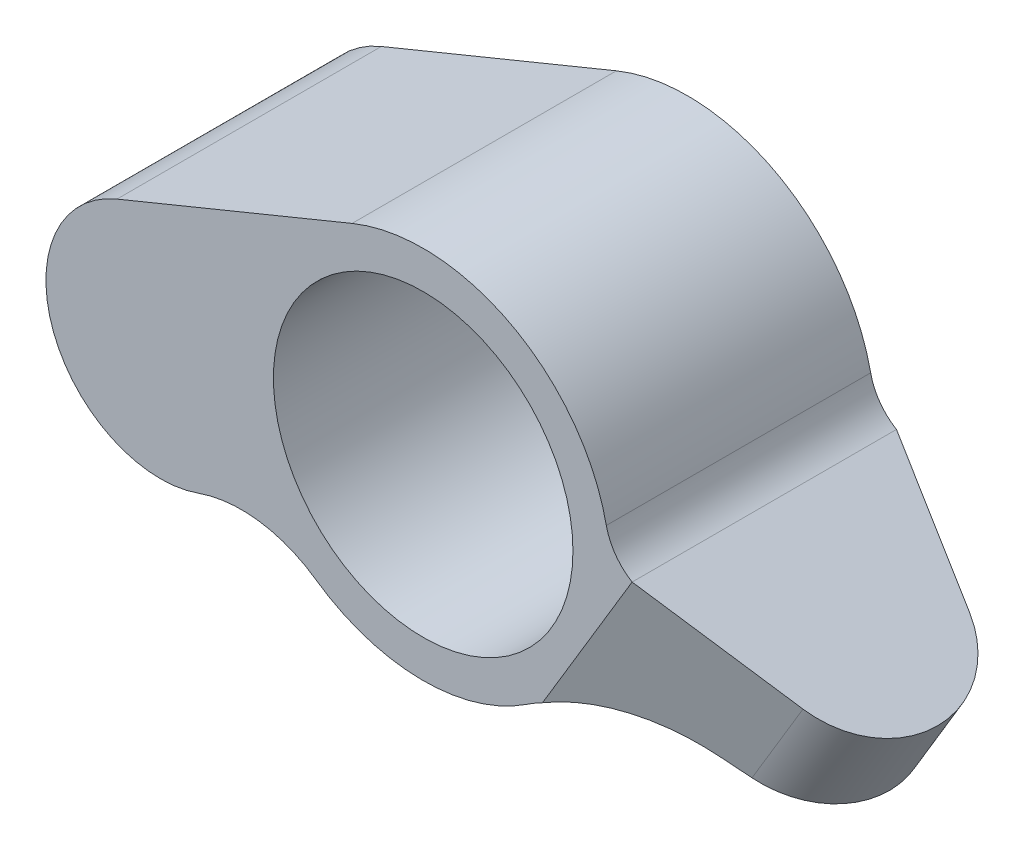
ISO-10303-21;
HEADER;
FILE_DESCRIPTION(('STEP AP214'),'2;1');
FILE_NAME('part.step','',(''),(''),'','','');
FILE_SCHEMA(('AUTOMOTIVE_DESIGN { 1 0 10303 214 1 1 1 1 }'));
ENDSEC;
DATA;
#1=APPLICATION_CONTEXT('core data for automotive mechanical design processes');
#2=APPLICATION_PROTOCOL_DEFINITION('international standard','automotive_design',2000,#1);
#3=PRODUCT_CONTEXT('',#1,'mechanical');
#4=PRODUCT('Part','Part','',(#3));
#5=PRODUCT_RELATED_PRODUCT_CATEGORY('part','',(#4));
#6=PRODUCT_DEFINITION_FORMATION('','',#4);
#7=PRODUCT_DEFINITION_CONTEXT('part definition',#1,'design');
#8=PRODUCT_DEFINITION('design','',#6,#7);
#9=PRODUCT_DEFINITION_SHAPE('','',#8);
#10=(LENGTH_UNIT() NAMED_UNIT(*) SI_UNIT(.MILLI.,.METRE.));
#11=(NAMED_UNIT(*) PLANE_ANGLE_UNIT() SI_UNIT($,.RADIAN.));
#12=(NAMED_UNIT(*) SI_UNIT($,.STERADIAN.) SOLID_ANGLE_UNIT());
#13=UNCERTAINTY_MEASURE_WITH_UNIT(LENGTH_MEASURE(1.E-05),#10,'distance_accuracy_value','');
#14=(GEOMETRIC_REPRESENTATION_CONTEXT(3) GLOBAL_UNCERTAINTY_ASSIGNED_CONTEXT((#13)) GLOBAL_UNIT_ASSIGNED_CONTEXT((#10,
#11,#12)) REPRESENTATION_CONTEXT('',''));
#15=CARTESIAN_POINT('',(0.,0.,0.));
#16=DIRECTION('',(0.,0.,1.));
#17=DIRECTION('',(1.,0.,0.));
#18=AXIS2_PLACEMENT_3D('',#15,#16,#17);
#19=CARTESIAN_POINT('',(0.,0.,30.));
#20=DIRECTION('',(0.,0.,1.));
#21=DIRECTION('',(1.,0.,0.));
#22=AXIS2_PLACEMENT_3D('',#19,#20,#21);
#23=PLANE('',#22);
#24=DIRECTION('',(0.514597737540942,0.857431728196329,0.));
#25=VECTOR('',#24,1.);
#26=CARTESIAN_POINT('',(-3.4107831080691,-44.8994779564358,30.));
#27=LINE('',#26,#25);
#28=CARTESIAN_POINT('',(13.5424140480731,-16.6517650817021,30.));
#29=VERTEX_POINT('',#28);
#30=CARTESIAN_POINT('',(23.7149593753169,0.297907417392657,30.));
#31=VERTEX_POINT('',#30);
#32=EDGE_CURVE('E178',#29,#31,#27,.T.);
#33=ORIENTED_EDGE('',*,*,#32,.T.);
#34=CARTESIAN_POINT('',(26.9616140781212,5.70754012581619,30.));
#35=DIRECTION('',(0.,0.,-1.));
#36=DIRECTION('',(1.,0.,0.));
#37=AXIS2_PLACEMENT_3D('',#34,#35,#36);
#38=CIRCLE('',#37,6.30911188673074);
#39=CARTESIAN_POINT('',(20.7892874601642,4.40091205304736,30.));
#40=VERTEX_POINT('',#39);
#41=EDGE_CURVE('E234',#31,#40,#38,.T.);
#42=ORIENTED_EDGE('',*,*,#41,.T.);
#43=CARTESIAN_POINT('',(0.,0.,30.));
#44=DIRECTION('',(0.,0.,1.));
#45=DIRECTION('',(1.,0.,0.));
#46=AXIS2_PLACEMENT_3D('',#43,#44,#45);
#47=CIRCLE('',#46,21.25);
#48=CARTESIAN_POINT('',(-8.06749821939952,19.6590430204521,30.));
#49=VERTEX_POINT('',#48);
#50=EDGE_CURVE('E112',#40,#49,#47,.T.);
#51=ORIENTED_EDGE('',*,*,#50,.T.);
#52=DIRECTION('',(-0.925131436256568,-0.379646975030566,0.));
#53=VECTOR('',#52,1.);
#54=CARTESIAN_POINT('',(-34.7513665540024,8.70876125688181,30.));
#55=LINE('',#54,#53);
#56=CARTESIAN_POINT('',(-34.7513665540024,8.70876125688181,30.));
#57=VERTEX_POINT('',#56);
#58=EDGE_CURVE('E105',#49,#57,#55,.T.);
#59=ORIENTED_EDGE('',*,*,#58,.T.);
#60=CARTESIAN_POINT('',(-29.815955878605,-3.31794741445358,30.));
#61=DIRECTION('',(0.,0.,1.));
#62=DIRECTION('',(1.,0.,0.));
#63=AXIS2_PLACEMENT_3D('',#60,#61,#62);
#64=CIRCLE('',#63,13.);
#65=CARTESIAN_POINT('',(-25.5062697870249,-15.5827998714561,30.));
#66=VERTEX_POINT('',#65);
#67=EDGE_CURVE('E110',#57,#66,#64,.T.);
#68=ORIENTED_EDGE('',*,*,#67,.T.);
#69=CARTESIAN_POINT('',(-20.6251605038312,-29.4738545591366,30.));
#70=DIRECTION('',(0.,0.,-1.));
#71=DIRECTION('',(1.,0.,0.));
#72=AXIS2_PLACEMENT_3D('',#69,#70,#71);
#73=CIRCLE('',#72,14.7236757696782);
#74=CARTESIAN_POINT('',(-12.1834828198412,-17.4104924220607,30.));
#75=VERTEX_POINT('',#74);
#76=EDGE_CURVE('E54',#66,#75,#73,.T.);
#77=ORIENTED_EDGE('',*,*,#76,.T.);
#78=CARTESIAN_POINT('',(0.,0.,30.));
#79=DIRECTION('',(0.,0.,1.));
#80=DIRECTION('',(1.,0.,0.));
#81=AXIS2_PLACEMENT_3D('',#78,#79,#80);
#82=CIRCLE('',#81,21.25);
#83=CARTESIAN_POINT('',(11.7883045630856,-17.680451790832,30.));
#84=VERTEX_POINT('',#83);
#85=EDGE_CURVE('E144',#75,#84,#82,.T.);
#86=ORIENTED_EDGE('',*,*,#85,.T.);
#87=CARTESIAN_POINT('',(21.5753117139314,-32.3592978607678,30.));
#88=DIRECTION('',(0.,0.,-1.));
#89=DIRECTION('',(1.,0.,0.));
#90=AXIS2_PLACEMENT_3D('',#87,#88,#89);
#91=CIRCLE('',#90,17.6423930042264);
#92=EDGE_CURVE('E95',#84,#29,#91,.T.);
#93=ORIENTED_EDGE('',*,*,#92,.T.);
#94=EDGE_LOOP('',(#33,#42,#51,#59,#68,#77,#86,#93));
#95=FACE_BOUND('',#94,.T.);
#96=CARTESIAN_POINT('',(0.,0.,30.));
#97=DIRECTION('',(0.,0.,1.));
#98=DIRECTION('',(1.,0.,0.));
#99=AXIS2_PLACEMENT_3D('',#96,#97,#98);
#100=CIRCLE('',#99,17.);
#101=CARTESIAN_POINT('',(17.,0.,30.));
#102=VERTEX_POINT('',#101);
#103=EDGE_CURVE('E134',#102,#102,#100,.T.);
#104=ORIENTED_EDGE('',*,*,#103,.F.);
#105=EDGE_LOOP('',(#104));
#106=FACE_BOUND('',#105,.T.);
#107=ADVANCED_FACE('F37',(#95,#106),#23,.T.);
#108=CARTESIAN_POINT('',(0.,0.,0.));
#109=DIRECTION('',(0.,0.,1.));
#110=DIRECTION('',(1.,0.,0.));
#111=AXIS2_PLACEMENT_3D('',#108,#109,#110);
#112=PLANE('',#111);
#113=CARTESIAN_POINT('',(26.9616140781212,5.70754012581619,0.));
#114=DIRECTION('',(0.,0.,-1.));
#115=DIRECTION('',(1.,0.,0.));
#116=AXIS2_PLACEMENT_3D('',#113,#114,#115);
#117=CIRCLE('',#116,6.30911188673074);
#118=CARTESIAN_POINT('',(23.7149593753169,0.297907417392654,0.));
#119=VERTEX_POINT('',#118);
#120=CARTESIAN_POINT('',(20.7892874601642,4.40091205304736,0.));
#121=VERTEX_POINT('',#120);
#122=EDGE_CURVE('E137',#119,#121,#117,.T.);
#123=ORIENTED_EDGE('',*,*,#122,.F.);
#124=DIRECTION('',(0.514597737540942,0.857431728196329,0.));
#125=VECTOR('',#124,1.);
#126=CARTESIAN_POINT('',(-3.4107831080691,-44.8994779564358,0.));
#127=LINE('',#126,#125);
#128=CARTESIAN_POINT('',(13.5424140480732,-16.6517650817021,0.));
#129=VERTEX_POINT('',#128);
#130=EDGE_CURVE('E204',#129,#119,#127,.T.);
#131=ORIENTED_EDGE('',*,*,#130,.F.);
#132=CARTESIAN_POINT('',(21.5753117139314,-32.3592978607678,0.));
#133=DIRECTION('',(0.,0.,-1.));
#134=DIRECTION('',(1.,0.,0.));
#135=AXIS2_PLACEMENT_3D('',#132,#133,#134);
#136=CIRCLE('',#135,17.6423930042264);
#137=CARTESIAN_POINT('',(11.7883045630856,-17.680451790832,0.));
#138=VERTEX_POINT('',#137);
#139=EDGE_CURVE('E133',#138,#129,#136,.T.);
#140=ORIENTED_EDGE('',*,*,#139,.F.);
#141=CARTESIAN_POINT('',(0.,0.,0.));
#142=DIRECTION('',(0.,0.,1.));
#143=DIRECTION('',(1.,0.,0.));
#144=AXIS2_PLACEMENT_3D('',#141,#142,#143);
#145=CIRCLE('',#144,21.25);
#146=CARTESIAN_POINT('',(-12.1834828198412,-17.4104924220607,0.));
#147=VERTEX_POINT('',#146);
#148=EDGE_CURVE('E130',#147,#138,#145,.T.);
#149=ORIENTED_EDGE('',*,*,#148,.F.);
#150=CARTESIAN_POINT('',(-20.6251605038312,-29.4738545591366,0.));
#151=DIRECTION('',(0.,0.,-1.));
#152=DIRECTION('',(1.,0.,0.));
#153=AXIS2_PLACEMENT_3D('',#150,#151,#152);
#154=CIRCLE('',#153,14.7236757696782);
#155=CARTESIAN_POINT('',(-25.5062697870249,-15.5827998714561,0.));
#156=VERTEX_POINT('',#155);
#157=EDGE_CURVE('E87',#156,#147,#154,.T.);
#158=ORIENTED_EDGE('',*,*,#157,.F.);
#159=CARTESIAN_POINT('',(-29.815955878605,-3.31794741445358,0.));
#160=DIRECTION('',(0.,0.,1.));
#161=DIRECTION('',(1.,0.,0.));
#162=AXIS2_PLACEMENT_3D('',#159,#160,#161);
#163=CIRCLE('',#162,13.);
#164=CARTESIAN_POINT('',(-34.7513665540024,8.70876125688181,0.));
#165=VERTEX_POINT('',#164);
#166=EDGE_CURVE('E81',#165,#156,#163,.T.);
#167=ORIENTED_EDGE('',*,*,#166,.F.);
#168=DIRECTION('',(-0.925131436256568,-0.379646975030566,0.));
#169=VECTOR('',#168,1.);
#170=CARTESIAN_POINT('',(-34.7513665540024,8.70876125688181,0.));
#171=LINE('',#170,#169);
#172=CARTESIAN_POINT('',(-8.06749821939952,19.6590430204521,0.));
#173=VERTEX_POINT('',#172);
#174=EDGE_CURVE('E120',#173,#165,#171,.T.);
#175=ORIENTED_EDGE('',*,*,#174,.F.);
#176=CARTESIAN_POINT('',(0.,0.,0.));
#177=DIRECTION('',(0.,0.,1.));
#178=DIRECTION('',(1.,0.,0.));
#179=AXIS2_PLACEMENT_3D('',#176,#177,#178);
#180=CIRCLE('',#179,21.25);
#181=EDGE_CURVE('E139',#121,#173,#180,.T.);
#182=ORIENTED_EDGE('',*,*,#181,.F.);
#183=EDGE_LOOP('',(#123,#131,#140,#149,#158,#167,#175,#182));
#184=FACE_BOUND('',#183,.T.);
#185=CARTESIAN_POINT('',(0.,0.,0.));
#186=DIRECTION('',(0.,0.,1.));
#187=DIRECTION('',(1.,0.,0.));
#188=AXIS2_PLACEMENT_3D('',#185,#186,#187);
#189=CIRCLE('',#188,17.);
#190=CARTESIAN_POINT('',(17.,0.,0.));
#191=VERTEX_POINT('',#190);
#192=EDGE_CURVE('E227',#191,#191,#189,.T.);
#193=ORIENTED_EDGE('',*,*,#192,.T.);
#194=EDGE_LOOP('',(#193));
#195=FACE_BOUND('',#194,.T.);
#196=ADVANCED_FACE('F244',(#184,#195),#112,.F.);
#197=CARTESIAN_POINT('',(0.,0.,30.));
#198=DIRECTION('',(0.,0.,-1.));
#199=DIRECTION('',(-1.,0.,0.));
#200=AXIS2_PLACEMENT_3D('',#197,#198,#199);
#201=CYLINDRICAL_SURFACE('',#200,21.25);
#202=ORIENTED_EDGE('',*,*,#148,.T.);
#203=DIRECTION('',(0.,0.,-1.));
#204=VECTOR('',#203,1.);
#205=CARTESIAN_POINT('',(11.7883045630856,-17.680451790832,30.));
#206=LINE('',#205,#204);
#207=EDGE_CURVE('E11',#84,#138,#206,.T.);
#208=ORIENTED_EDGE('',*,*,#207,.F.);
#209=ORIENTED_EDGE('',*,*,#85,.F.);
#210=DIRECTION('',(0.,0.,-1.));
#211=VECTOR('',#210,1.);
#212=CARTESIAN_POINT('',(-12.1834828198412,-17.4104924220607,30.));
#213=LINE('',#212,#211);
#214=EDGE_CURVE('E126',#75,#147,#213,.T.);
#215=ORIENTED_EDGE('',*,*,#214,.T.);
#216=EDGE_LOOP('',(#202,#208,#209,#215));
#217=FACE_BOUND('',#216,.T.);
#218=ADVANCED_FACE('F39',(#217),#201,.T.);
#219=CARTESIAN_POINT('',(21.5753117139314,-32.3592978607678,30.));
#220=DIRECTION('',(0.,0.,-1.));
#221=DIRECTION('',(-1.,0.,0.));
#222=AXIS2_PLACEMENT_3D('',#219,#220,#221);
#223=CYLINDRICAL_SURFACE('',#222,17.6423930042264);
#224=DIRECTION('',(0.,0.,-1.));
#225=VECTOR('',#224,1.);
#226=CARTESIAN_POINT('',(29.1269563430686,-16.4148099633532,30.));
#227=LINE('',#226,#225);
#228=CARTESIAN_POINT('',(29.1269563430686,-16.4148099633532,25.4705194765817));
#229=VERTEX_POINT('',#228);
#230=CARTESIAN_POINT('',(29.1269563430686,-16.4148099633532,4.53956595923639));
#231=VERTEX_POINT('',#230);
#232=EDGE_CURVE('E46',#229,#231,#227,.T.);
#233=ORIENTED_EDGE('',*,*,#232,.F.);
#234=CARTESIAN_POINT('',(21.5753117139314,-32.3592978607678,24.8787173851145));
#235=DIRECTION('',(-0.277526491262813,0.166560788241345,-0.946169408968486));
#236=DIRECTION('',(0.811275671498348,-0.486896637185634,-0.323671823815769));
#237=AXIS2_PLACEMENT_3D('',#234,#235,#236);
#238=ELLIPSE('',#237,18.6461249296361,17.6423930042264);
#239=EDGE_CURVE('E172',#229,#29,#238,.F.);
#240=ORIENTED_EDGE('',*,*,#239,.T.);
#241=ORIENTED_EDGE('',*,*,#92,.F.);
#242=ORIENTED_EDGE('',*,*,#207,.T.);
#243=ORIENTED_EDGE('',*,*,#139,.T.);
#244=CARTESIAN_POINT('',(21.5753117139314,-32.3592978607678,5.13268576958542));
#245=DIRECTION('',(-0.27807950571675,0.166892686370917,0.945948529115737));
#246=DIRECTION('',(-0.811086282104482,0.486782972913141,-0.324316789981298));
#247=AXIS2_PLACEMENT_3D('',#244,#245,#246);
#248=ELLIPSE('',#247,18.6504788169799,17.6423930042264);
#249=EDGE_CURVE('E174',#129,#231,#248,.F.);
#250=ORIENTED_EDGE('',*,*,#249,.T.);
#251=EDGE_LOOP('',(#233,#240,#241,#242,#243,#250));
#252=FACE_BOUND('',#251,.T.);
#253=ADVANCED_FACE('F169',(#252),#223,.F.);
#254=CARTESIAN_POINT('',(37.9807726536135,-20.6081634795697,30.));
#255=DIRECTION('',(0.428039701152111,0.903759931750468,0.));
#256=DIRECTION('',(-0.903759931750469,0.428039701152111,0.));
#257=AXIS2_PLACEMENT_3D('',#254,#255,#256);
#258=PLANE('',#257);
#259=CARTESIAN_POINT('',(28.8493476696742,-16.2833286601638,15.0061602238083));
#260=DIRECTION('',(0.428039701152111,0.903759931750468,0.));
#261=DIRECTION('',(0.903759931750469,-0.428039701152111,0.));
#262=AXIS2_PLACEMENT_3D('',#259,#260,#261);
#263=ELLIPSE('',#262,10.0484263616105,10.);
#264=CARTESIAN_POINT('',(31.7945868549387,-17.678255848671,5.54667493265091));
#265=VERTEX_POINT('',#264);
#266=CARTESIAN_POINT('',(31.7887296816977,-17.6754817683034,24.4678543134931));
#267=VERTEX_POINT('',#266);
#268=EDGE_CURVE('E201',#265,#267,#263,.F.);
#269=ORIENTED_EDGE('',*,*,#268,.T.);
#270=DIRECTION('',(-0.855541019126242,0.405202210548188,0.322274313526992));
#271=VECTOR('',#270,1.);
#272=CARTESIAN_POINT('',(35.8123454371636,-19.58115076846,22.9521958278094));
#273=LINE('',#272,#271);
#274=EDGE_CURVE('E165',#267,#229,#273,.T.);
#275=ORIENTED_EDGE('',*,*,#274,.T.);
#276=ORIENTED_EDGE('',*,*,#232,.T.);
#277=DIRECTION('',(0.855343016503662,-0.405108432344022,0.322917144422816));
#278=VECTOR('',#277,1.);
#279=CARTESIAN_POINT('',(44.0898339480564,-23.5015433240694,10.1884923143042));
#280=LINE('',#279,#278);
#281=EDGE_CURVE('E163',#231,#265,#280,.T.);
#282=ORIENTED_EDGE('',*,*,#281,.T.);
#283=EDGE_LOOP('',(#269,#275,#276,#282));
#284=FACE_BOUND('',#283,.T.);
#285=ADVANCED_FACE('F160',(#284),#258,.F.);
#286=CARTESIAN_POINT('',(43.380202362474,-11.5044194811832,30.));
#287=DIRECTION('',(-0.514597737540942,-0.857431728196329,0.));
#288=DIRECTION('',(0.857431728196329,-0.514597737540942,0.));
#289=AXIS2_PLACEMENT_3D('',#286,#287,#288);
#290=PLANE('',#289);
#291=DIRECTION('',(0.,0.,-1.));
#292=VECTOR('',#291,1.);
#293=CARTESIAN_POINT('',(23.7149593753169,0.297907417392654,30.));
#294=LINE('',#293,#292);
#295=EDGE_CURVE('E151',#31,#119,#294,.T.);
#296=ORIENTED_EDGE('',*,*,#295,.F.);
#297=DIRECTION('',(-0.811275671498348,0.486896637185633,0.323671823815769));
#298=VECTOR('',#297,1.);
#299=CARTESIAN_POINT('',(37.5811499931388,-8.02404998818726,24.4678543134931));
#300=LINE('',#299,#298);
#301=CARTESIAN_POINT('',(37.5811499931388,-8.02404998818726,24.4678543134931));
#302=VERTEX_POINT('',#301);
#303=EDGE_CURVE('E215',#302,#31,#300,.T.);
#304=ORIENTED_EDGE('',*,*,#303,.F.);
#305=CARTESIAN_POINT('',(34.8058850805107,-6.35844210577381,15.0061602238083));
#306=DIRECTION('',(-0.514597737540942,-0.857431728196329,0.));
#307=DIRECTION('',(-0.857431728196329,0.514597737540942,0.));
#308=AXIS2_PLACEMENT_3D('',#305,#306,#307);
#309=CIRCLE('',#308,10.);
#310=CARTESIAN_POINT('',(37.5866801376782,-8.02736896948298,5.54667493265091));
#311=VERTEX_POINT('',#310);
#312=EDGE_CURVE('E199',#311,#302,#309,.T.);
#313=ORIENTED_EDGE('',*,*,#312,.F.);
#314=DIRECTION('',(0.811086282104482,-0.486782972913141,0.324316789981298));
#315=VECTOR('',#314,1.);
#316=CARTESIAN_POINT('',(37.5866801376782,-8.02736896948298,5.54667493265091));
#317=LINE('',#316,#315);
#318=EDGE_CURVE('E207',#119,#311,#317,.T.);
#319=ORIENTED_EDGE('',*,*,#318,.F.);
#320=EDGE_LOOP('',(#296,#304,#313,#319));
#321=FACE_BOUND('',#320,.T.);
#322=ADVANCED_FACE('F214',(#321),#290,.F.);
#323=CARTESIAN_POINT('',(26.9616140781212,5.70754012581619,30.));
#324=DIRECTION('',(0.,0.,-1.));
#325=DIRECTION('',(-1.,0.,0.));
#326=AXIS2_PLACEMENT_3D('',#323,#324,#325);
#327=CYLINDRICAL_SURFACE('',#326,6.30911188673074);
#328=ORIENTED_EDGE('',*,*,#122,.T.);
#329=DIRECTION('',(0.,0.,-1.));
#330=VECTOR('',#329,1.);
#331=CARTESIAN_POINT('',(20.7892874601642,4.40091205304736,30.));
#332=LINE('',#331,#330);
#333=EDGE_CURVE('E148',#40,#121,#332,.T.);
#334=ORIENTED_EDGE('',*,*,#333,.F.);
#335=ORIENTED_EDGE('',*,*,#41,.F.);
#336=ORIENTED_EDGE('',*,*,#295,.T.);
#337=EDGE_LOOP('',(#328,#334,#335,#336));
#338=FACE_BOUND('',#337,.T.);
#339=ADVANCED_FACE('F238',(#338),#327,.F.);
#340=CARTESIAN_POINT('',(0.,0.,30.));
#341=DIRECTION('',(0.,0.,-1.));
#342=DIRECTION('',(-1.,0.,0.));
#343=AXIS2_PLACEMENT_3D('',#340,#341,#342);
#344=CYLINDRICAL_SURFACE('',#343,21.25);
#345=ORIENTED_EDGE('',*,*,#181,.T.);
#346=DIRECTION('',(0.,0.,-1.));
#347=VECTOR('',#346,1.);
#348=CARTESIAN_POINT('',(-8.06749821939952,19.6590430204521,30.));
#349=LINE('',#348,#347);
#350=EDGE_CURVE('E121',#49,#173,#349,.T.);
#351=ORIENTED_EDGE('',*,*,#350,.F.);
#352=ORIENTED_EDGE('',*,*,#50,.F.);
#353=ORIENTED_EDGE('',*,*,#333,.T.);
#354=EDGE_LOOP('',(#345,#351,#352,#353));
#355=FACE_BOUND('',#354,.T.);
#356=ADVANCED_FACE('F242',(#355),#344,.T.);
#357=CARTESIAN_POINT('',(-34.7513665540024,8.70876125688181,30.));
#358=DIRECTION('',(0.379646975030566,-0.925131436256568,0.));
#359=DIRECTION('',(0.925131436256568,0.379646975030566,0.));
#360=AXIS2_PLACEMENT_3D('',#357,#358,#359);
#361=PLANE('',#360);
#362=ORIENTED_EDGE('',*,*,#174,.T.);
#363=DIRECTION('',(0.,0.,-1.));
#364=VECTOR('',#363,1.);
#365=CARTESIAN_POINT('',(-34.7513665540024,8.70876125688181,30.));
#366=LINE('',#365,#364);
#367=EDGE_CURVE('E117',#57,#165,#366,.T.);
#368=ORIENTED_EDGE('',*,*,#367,.F.);
#369=ORIENTED_EDGE('',*,*,#58,.F.);
#370=ORIENTED_EDGE('',*,*,#350,.T.);
#371=EDGE_LOOP('',(#362,#368,#369,#370));
#372=FACE_BOUND('',#371,.T.);
#373=ADVANCED_FACE('F118',(#372),#361,.F.);
#374=CARTESIAN_POINT('',(-29.815955878605,-3.31794741445358,30.));
#375=DIRECTION('',(0.,0.,-1.));
#376=DIRECTION('',(-1.,0.,0.));
#377=AXIS2_PLACEMENT_3D('',#374,#375,#376);
#378=CYLINDRICAL_SURFACE('',#377,13.);
#379=ORIENTED_EDGE('',*,*,#166,.T.);
#380=DIRECTION('',(0.,0.,-1.));
#381=VECTOR('',#380,1.);
#382=CARTESIAN_POINT('',(-25.5062697870249,-15.5827998714561,30.));
#383=LINE('',#382,#381);
#384=EDGE_CURVE('E122',#66,#156,#383,.T.);
#385=ORIENTED_EDGE('',*,*,#384,.F.);
#386=ORIENTED_EDGE('',*,*,#67,.F.);
#387=ORIENTED_EDGE('',*,*,#367,.T.);
#388=EDGE_LOOP('',(#379,#385,#386,#387));
#389=FACE_BOUND('',#388,.T.);
#390=ADVANCED_FACE('F124',(#389),#378,.T.);
#391=CARTESIAN_POINT('',(-20.6251605038312,-29.4738545591366,30.));
#392=DIRECTION('',(0.,0.,-1.));
#393=DIRECTION('',(-1.,0.,0.));
#394=AXIS2_PLACEMENT_3D('',#391,#392,#393);
#395=CYLINDRICAL_SURFACE('',#394,14.7236757696782);
#396=ORIENTED_EDGE('',*,*,#157,.T.);
#397=ORIENTED_EDGE('',*,*,#214,.F.);
#398=ORIENTED_EDGE('',*,*,#76,.F.);
#399=ORIENTED_EDGE('',*,*,#384,.T.);
#400=EDGE_LOOP('',(#396,#397,#398,#399));
#401=FACE_BOUND('',#400,.T.);
#402=ADVANCED_FACE('F250',(#401),#395,.F.);
#403=CARTESIAN_POINT('',(0.,0.,30.));
#404=DIRECTION('',(0.,0.,-1.));
#405=DIRECTION('',(-1.,0.,0.));
#406=AXIS2_PLACEMENT_3D('',#403,#404,#405);
#407=CYLINDRICAL_SURFACE('',#406,17.);
#408=ORIENTED_EDGE('',*,*,#103,.T.);
#409=EDGE_LOOP('',(#408));
#410=FACE_BOUND('',#409,.T.);
#411=ORIENTED_EDGE('',*,*,#192,.F.);
#412=EDGE_LOOP('',(#411));
#413=FACE_BOUND('',#412,.T.);
#414=ADVANCED_FACE('F252',(#410,#413),#407,.F.);
#415=CARTESIAN_POINT('',(7.68014259712475,-51.5558274796023,15.0061602238083));
#416=DIRECTION('',(0.514597737540942,0.857431728196329,0.));
#417=DIRECTION('',(-0.857431728196329,0.514597737540942,0.));
#418=AXIS2_PLACEMENT_3D('',#415,#416,#417);
#419=CYLINDRICAL_SURFACE('',#418,10.);
#420=DIRECTION('',(0.514597737540942,0.857431728196329,0.));
#421=VECTOR('',#420,1.);
#422=CARTESIAN_POINT('',(10.4609376542922,-53.2247543433114,5.54667493265091));
#423=LINE('',#422,#421);
#424=EDGE_CURVE('E194',#265,#311,#423,.T.);
#425=ORIENTED_EDGE('',*,*,#424,.T.);
#426=ORIENTED_EDGE('',*,*,#312,.T.);
#427=DIRECTION('',(0.514597737540942,0.857431728196329,0.));
#428=VECTOR('',#427,1.);
#429=CARTESIAN_POINT('',(10.4554075097529,-53.2214353620157,24.4678543134931));
#430=LINE('',#429,#428);
#431=EDGE_CURVE('E203',#267,#302,#430,.T.);
#432=ORIENTED_EDGE('',*,*,#431,.F.);
#433=ORIENTED_EDGE('',*,*,#268,.F.);
#434=EDGE_LOOP('',(#425,#426,#432,#433));
#435=FACE_BOUND('',#434,.T.);
#436=ADVANCED_FACE('F196',(#435),#419,.T.);
#437=CARTESIAN_POINT('',(10.4554075097529,-53.2214353620157,24.4678543134931));
#438=DIRECTION('',(-0.277526491262813,0.166560788241345,-0.946169408968486));
#439=DIRECTION('',(-0.959573510887893,0.,0.281458126907509));
#440=AXIS2_PLACEMENT_3D('',#437,#438,#439);
#441=PLANE('',#440);
#442=ORIENTED_EDGE('',*,*,#274,.F.);
#443=ORIENTED_EDGE('',*,*,#431,.T.);
#444=ORIENTED_EDGE('',*,*,#303,.T.);
#445=ORIENTED_EDGE('',*,*,#32,.F.);
#446=ORIENTED_EDGE('',*,*,#239,.F.);
#447=EDGE_LOOP('',(#442,#443,#444,#445,#446));
#448=FACE_BOUND('',#447,.T.);
#449=ADVANCED_FACE('F270',(#448),#441,.F.);
#450=CARTESIAN_POINT('',(10.4609376542922,-53.2247543433114,5.54667493265091));
#451=DIRECTION('',(-0.27807950571675,0.166892686370917,0.945948529115737));
#452=DIRECTION('',(0.959404108187527,0.,0.282035028308358));
#453=AXIS2_PLACEMENT_3D('',#450,#451,#452);
#454=PLANE('',#453);
#455=ORIENTED_EDGE('',*,*,#130,.T.);
#456=ORIENTED_EDGE('',*,*,#318,.T.);
#457=ORIENTED_EDGE('',*,*,#424,.F.);
#458=ORIENTED_EDGE('',*,*,#281,.F.);
#459=ORIENTED_EDGE('',*,*,#249,.F.);
#460=EDGE_LOOP('',(#455,#456,#457,#458,#459));
#461=FACE_BOUND('',#460,.T.);
#462=ADVANCED_FACE('F208',(#461),#454,.F.);
#463=CLOSED_SHELL('',(#107,#196,#218,#253,#285,#322,#339,#356,#373,#390,#402,#414,#436,#449,#462));
#464=MANIFOLD_SOLID_BREP('B2',#463);
#465=ADVANCED_BREP_SHAPE_REPRESENTATION('',(#18,#464),#14);
#466=SHAPE_DEFINITION_REPRESENTATION(#9,#465);
ENDSEC;
END-ISO-10303-21;
